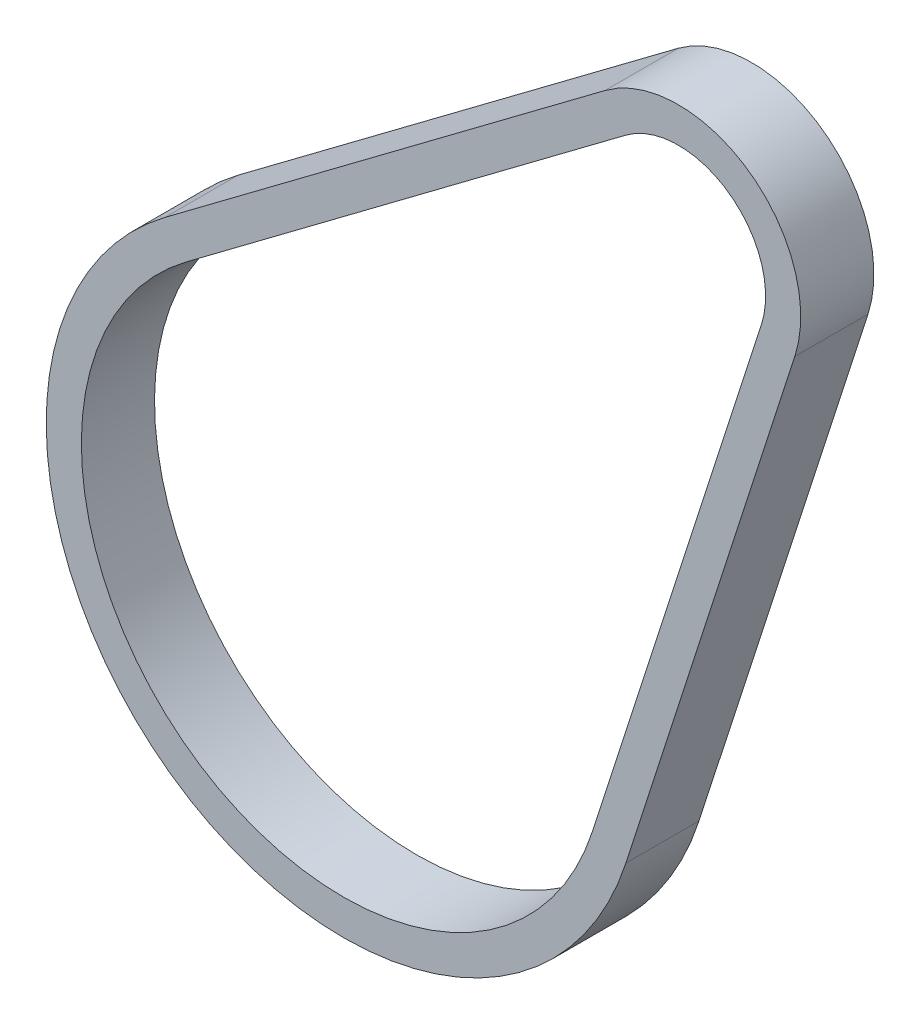
ISO-10303-21;
HEADER;
FILE_DESCRIPTION(('STEP AP214'),'2;1');
FILE_NAME('part.step','',(''),(''),'','','');
FILE_SCHEMA(('AUTOMOTIVE_DESIGN { 1 0 10303 214 1 1 1 1 }'));
ENDSEC;
DATA;
#1=APPLICATION_CONTEXT('core data for automotive mechanical design processes');
#2=APPLICATION_PROTOCOL_DEFINITION('international standard','automotive_design',2000,#1);
#3=PRODUCT_CONTEXT('',#1,'mechanical');
#4=PRODUCT('Part','Part','',(#3));
#5=PRODUCT_RELATED_PRODUCT_CATEGORY('part','',(#4));
#6=PRODUCT_DEFINITION_FORMATION('','',#4);
#7=PRODUCT_DEFINITION_CONTEXT('part definition',#1,'design');
#8=PRODUCT_DEFINITION('design','',#6,#7);
#9=PRODUCT_DEFINITION_SHAPE('','',#8);
#10=(LENGTH_UNIT() NAMED_UNIT(*) SI_UNIT(.MILLI.,.METRE.));
#11=(NAMED_UNIT(*) PLANE_ANGLE_UNIT() SI_UNIT($,.RADIAN.));
#12=(NAMED_UNIT(*) SI_UNIT($,.STERADIAN.) SOLID_ANGLE_UNIT());
#13=UNCERTAINTY_MEASURE_WITH_UNIT(LENGTH_MEASURE(1.E-05),#10,'distance_accuracy_value','');
#14=(GEOMETRIC_REPRESENTATION_CONTEXT(3) GLOBAL_UNCERTAINTY_ASSIGNED_CONTEXT((#13)) GLOBAL_UNIT_ASSIGNED_CONTEXT((#10,
#11,#12)) REPRESENTATION_CONTEXT('',''));
#15=CARTESIAN_POINT('',(0.,0.,0.));
#16=DIRECTION('',(0.,0.,1.));
#17=DIRECTION('',(1.,0.,0.));
#18=AXIS2_PLACEMENT_3D('',#15,#16,#17);
#19=CARTESIAN_POINT('',(22.9066901451778,32.0924847484674,-5.));
#20=DIRECTION('',(0.,0.,1.));
#21=DIRECTION('',(1.,0.,0.));
#22=AXIS2_PLACEMENT_3D('',#19,#20,#21);
#23=CYLINDRICAL_SURFACE('',#22,8.36197243913529);
#24=CARTESIAN_POINT('',(22.9066901451778,32.0924847484674,0.));
#25=DIRECTION('',(0.,0.,-1.));
#26=DIRECTION('',(-1.,0.,0.));
#27=AXIS2_PLACEMENT_3D('',#24,#25,#26);
#28=CIRCLE('',#27,8.36197243913529);
#29=CARTESIAN_POINT('',(30.8640727659891,29.5229235215515,0.));
#30=VERTEX_POINT('',#29);
#31=CARTESIAN_POINT('',(17.8906899962337,38.7829500221722,0.));
#32=VERTEX_POINT('',#31);
#33=EDGE_CURVE('E157',#30,#32,#28,.F.);
#34=ORIENTED_EDGE('',*,*,#33,.F.);
#35=DIRECTION('',(0.,0.,1.));
#36=VECTOR('',#35,1.);
#37=CARTESIAN_POINT('',(30.8640727659891,29.5229235215515,-5.));
#38=LINE('',#37,#36);
#39=CARTESIAN_POINT('',(30.8640727659891,29.5229235215515,-5.));
#40=VERTEX_POINT('',#39);
#41=EDGE_CURVE('E12',#40,#30,#38,.T.);
#42=ORIENTED_EDGE('',*,*,#41,.F.);
#43=CARTESIAN_POINT('',(22.9066901451778,32.0924847484674,-5.));
#44=DIRECTION('',(0.,0.,-1.));
#45=DIRECTION('',(-1.,0.,0.));
#46=AXIS2_PLACEMENT_3D('',#43,#44,#45);
#47=CIRCLE('',#46,8.36197243913529);
#48=CARTESIAN_POINT('',(17.8906899962337,38.7829500221722,-5.));
#49=VERTEX_POINT('',#48);
#50=EDGE_CURVE('E161',#40,#49,#47,.F.);
#51=ORIENTED_EDGE('',*,*,#50,.T.);
#52=DIRECTION('',(0.,0.,1.));
#53=VECTOR('',#52,1.);
#54=CARTESIAN_POINT('',(17.8906899962337,38.7829500221722,-5.));
#55=LINE('',#54,#53);
#56=EDGE_CURVE('E62',#49,#32,#55,.T.);
#57=ORIENTED_EDGE('',*,*,#56,.T.);
#58=EDGE_LOOP('',(#34,#42,#51,#57));
#59=FACE_BOUND('',#58,.T.);
#60=ADVANCED_FACE('F59',(#59),#23,.T.);
#61=CARTESIAN_POINT('',(30.8640727659891,29.5229235215515,-5.));
#62=DIRECTION('',(0.951615504443602,-0.307291281527071,0.));
#63=DIRECTION('',(0.307291281527071,0.951615504443602,0.));
#64=AXIS2_PLACEMENT_3D('',#61,#62,#63);
#65=PLANE('',#64);
#66=DIRECTION('',(0.307291281527071,0.951615504443602,0.));
#67=VECTOR('',#66,1.);
#68=CARTESIAN_POINT('',(30.8640727659891,29.5229235215515,0.));
#69=LINE('',#68,#67);
#70=CARTESIAN_POINT('',(19.3164559799427,-6.23758070872166,0.));
#71=VERTEX_POINT('',#70);
#72=EDGE_CURVE('E165',#71,#30,#69,.T.);
#73=ORIENTED_EDGE('',*,*,#72,.F.);
#74=DIRECTION('',(0.,0.,1.));
#75=VECTOR('',#74,1.);
#76=CARTESIAN_POINT('',(19.3164559799427,-6.23758070872166,-5.));
#77=LINE('',#76,#75);
#78=CARTESIAN_POINT('',(19.3164559799427,-6.23758070872166,-5.));
#79=VERTEX_POINT('',#78);
#80=EDGE_CURVE('E67',#79,#71,#77,.T.);
#81=ORIENTED_EDGE('',*,*,#80,.F.);
#82=DIRECTION('',(0.307291281527071,0.951615504443602,0.));
#83=VECTOR('',#82,1.);
#84=CARTESIAN_POINT('',(30.8640727659891,29.5229235215515,-5.));
#85=LINE('',#84,#83);
#86=EDGE_CURVE('E171',#79,#40,#85,.T.);
#87=ORIENTED_EDGE('',*,*,#86,.T.);
#88=ORIENTED_EDGE('',*,*,#41,.T.);
#89=EDGE_LOOP('',(#73,#81,#87,#88));
#90=FACE_BOUND('',#89,.T.);
#91=ADVANCED_FACE('F197',(#90),#65,.T.);
#92=CARTESIAN_POINT('',(0.,0.,-5.));
#93=DIRECTION('',(0.,0.,1.));
#94=DIRECTION('',(1.,0.,0.));
#95=AXIS2_PLACEMENT_3D('',#92,#93,#94);
#96=CYLINDRICAL_SURFACE('',#95,20.2985931710274);
#97=CARTESIAN_POINT('',(0.,0.,0.));
#98=DIRECTION('',(0.,0.,-1.));
#99=DIRECTION('',(-1.,0.,0.));
#100=AXIS2_PLACEMENT_3D('',#97,#98,#99);
#101=CIRCLE('',#100,20.2985931710274);
#102=CARTESIAN_POINT('',(-12.1762834200109,16.2410285018668,0.));
#103=VERTEX_POINT('',#102);
#104=EDGE_CURVE('E179',#103,#71,#101,.F.);
#105=ORIENTED_EDGE('',*,*,#104,.F.);
#106=DIRECTION('',(0.,0.,1.));
#107=VECTOR('',#106,1.);
#108=CARTESIAN_POINT('',(-12.1762834200109,16.2410285018668,-5.));
#109=LINE('',#108,#107);
#110=CARTESIAN_POINT('',(-12.1762834200109,16.2410285018668,-5.));
#111=VERTEX_POINT('',#110);
#112=EDGE_CURVE('E184',#111,#103,#109,.T.);
#113=ORIENTED_EDGE('',*,*,#112,.F.);
#114=CARTESIAN_POINT('',(0.,0.,-5.));
#115=DIRECTION('',(0.,0.,-1.));
#116=DIRECTION('',(-1.,0.,0.));
#117=AXIS2_PLACEMENT_3D('',#114,#115,#116);
#118=CIRCLE('',#117,20.2985931710274);
#119=EDGE_CURVE('E168',#111,#79,#118,.F.);
#120=ORIENTED_EDGE('',*,*,#119,.T.);
#121=ORIENTED_EDGE('',*,*,#80,.T.);
#122=EDGE_LOOP('',(#105,#113,#120,#121));
#123=FACE_BOUND('',#122,.T.);
#124=ADVANCED_FACE('F201',(#123),#96,.T.);
#125=CARTESIAN_POINT('',(17.8906899962337,38.7829500221722,-5.));
#126=DIRECTION('',(-0.5998584885868,0.800106114006361,0.));
#127=DIRECTION('',(-0.800106114006361,-0.5998584885868,0.));
#128=AXIS2_PLACEMENT_3D('',#125,#126,#127);
#129=PLANE('',#128);
#130=DIRECTION('',(-0.800106114006361,-0.5998584885868,0.));
#131=VECTOR('',#130,1.);
#132=CARTESIAN_POINT('',(17.8906899962337,38.7829500221722,0.));
#133=LINE('',#132,#131);
#134=EDGE_CURVE('E176',#32,#103,#133,.T.);
#135=ORIENTED_EDGE('',*,*,#134,.F.);
#136=ORIENTED_EDGE('',*,*,#56,.F.);
#137=DIRECTION('',(-0.800106114006361,-0.5998584885868,0.));
#138=VECTOR('',#137,1.);
#139=CARTESIAN_POINT('',(17.8906899962337,38.7829500221722,-5.));
#140=LINE('',#139,#138);
#141=EDGE_CURVE('E164',#49,#111,#140,.T.);
#142=ORIENTED_EDGE('',*,*,#141,.T.);
#143=ORIENTED_EDGE('',*,*,#112,.T.);
#144=EDGE_LOOP('',(#135,#136,#142,#143));
#145=FACE_BOUND('',#144,.T.);
#146=ADVANCED_FACE('F192',(#145),#129,.T.);
#147=CARTESIAN_POINT('',(22.9066901451778,32.0924847484674,-5.));
#148=DIRECTION('',(0.,0.,-1.));
#149=DIRECTION('',(-1.,0.,0.));
#150=AXIS2_PLACEMENT_3D('',#147,#148,#149);
#151=PLANE('',#150);
#152=CARTESIAN_POINT('',(22.9066901451778,32.0924847484674,-5.));
#153=DIRECTION('',(0.,0.,-1.));
#154=DIRECTION('',(-1.,0.,0.));
#155=AXIS2_PLACEMENT_3D('',#152,#153,#154);
#156=CIRCLE('',#155,5.96197243913529);
#157=CARTESIAN_POINT('',(28.5801955553244,30.2604225972164,-5.));
#158=VERTEX_POINT('',#157);
#159=CARTESIAN_POINT('',(19.330350368842,36.862695348557,-5.));
#160=VERTEX_POINT('',#159);
#161=EDGE_CURVE('E126',#158,#160,#156,.F.);
#162=ORIENTED_EDGE('',*,*,#161,.T.);
#163=DIRECTION('',(-0.800106114006361,-0.5998584885868,0.));
#164=VECTOR('',#163,1.);
#165=CARTESIAN_POINT('',(19.330350368842,36.862695348557,-5.));
#166=LINE('',#165,#164);
#167=CARTESIAN_POINT('',(-10.7366230474025,14.3207738282516,-5.));
#168=VERTEX_POINT('',#167);
#169=EDGE_CURVE('E135',#160,#168,#166,.T.);
#170=ORIENTED_EDGE('',*,*,#169,.T.);
#171=CARTESIAN_POINT('',(0.,0.,-5.));
#172=DIRECTION('',(0.,0.,-1.));
#173=DIRECTION('',(-1.,0.,0.));
#174=AXIS2_PLACEMENT_3D('',#171,#172,#173);
#175=CIRCLE('',#174,17.8985931710274);
#176=CARTESIAN_POINT('',(17.0325787692781,-5.50008163305669,-5.));
#177=VERTEX_POINT('',#176);
#178=EDGE_CURVE('E75',#168,#177,#175,.F.);
#179=ORIENTED_EDGE('',*,*,#178,.T.);
#180=DIRECTION('',(0.307291281527071,0.951615504443602,0.));
#181=VECTOR('',#180,1.);
#182=CARTESIAN_POINT('',(28.5801955553244,30.2604225972164,-5.));
#183=LINE('',#182,#181);
#184=EDGE_CURVE('E132',#177,#158,#183,.T.);
#185=ORIENTED_EDGE('',*,*,#184,.T.);
#186=EDGE_LOOP('',(#162,#170,#179,#185));
#187=FACE_BOUND('',#186,.T.);
#188=ORIENTED_EDGE('',*,*,#50,.F.);
#189=ORIENTED_EDGE('',*,*,#86,.F.);
#190=ORIENTED_EDGE('',*,*,#119,.F.);
#191=ORIENTED_EDGE('',*,*,#141,.F.);
#192=EDGE_LOOP('',(#188,#189,#190,#191));
#193=FACE_BOUND('',#192,.T.);
#194=ADVANCED_FACE('F139',(#187,#193),#151,.T.);
#195=CARTESIAN_POINT('',(22.9066901451778,32.0924847484674,0.));
#196=DIRECTION('',(0.,0.,-1.));
#197=DIRECTION('',(-1.,0.,0.));
#198=AXIS2_PLACEMENT_3D('',#195,#196,#197);
#199=PLANE('',#198);
#200=DIRECTION('',(-0.800106114006361,-0.5998584885868,0.));
#201=VECTOR('',#200,1.);
#202=CARTESIAN_POINT('',(19.330350368842,36.862695348557,0.));
#203=LINE('',#202,#201);
#204=CARTESIAN_POINT('',(19.330350368842,36.862695348557,0.));
#205=VERTEX_POINT('',#204);
#206=CARTESIAN_POINT('',(-10.7366230474025,14.3207738282516,0.));
#207=VERTEX_POINT('',#206);
#208=EDGE_CURVE('E151',#205,#207,#203,.T.);
#209=ORIENTED_EDGE('',*,*,#208,.F.);
#210=CARTESIAN_POINT('',(22.9066901451778,32.0924847484674,0.));
#211=DIRECTION('',(0.,0.,-1.));
#212=DIRECTION('',(-1.,0.,0.));
#213=AXIS2_PLACEMENT_3D('',#210,#211,#212);
#214=CIRCLE('',#213,5.96197243913529);
#215=CARTESIAN_POINT('',(28.5801955553244,30.2604225972164,0.));
#216=VERTEX_POINT('',#215);
#217=EDGE_CURVE('E83',#216,#205,#214,.F.);
#218=ORIENTED_EDGE('',*,*,#217,.F.);
#219=DIRECTION('',(0.307291281527071,0.951615504443602,0.));
#220=VECTOR('',#219,1.);
#221=CARTESIAN_POINT('',(28.5801955553244,30.2604225972164,0.));
#222=LINE('',#221,#220);
#223=CARTESIAN_POINT('',(17.0325787692781,-5.50008163305669,0.));
#224=VERTEX_POINT('',#223);
#225=EDGE_CURVE('E142',#224,#216,#222,.T.);
#226=ORIENTED_EDGE('',*,*,#225,.F.);
#227=CARTESIAN_POINT('',(0.,0.,0.));
#228=DIRECTION('',(0.,0.,-1.));
#229=DIRECTION('',(-1.,0.,0.));
#230=AXIS2_PLACEMENT_3D('',#227,#228,#229);
#231=CIRCLE('',#230,17.8985931710274);
#232=EDGE_CURVE('E145',#207,#224,#231,.F.);
#233=ORIENTED_EDGE('',*,*,#232,.F.);
#234=EDGE_LOOP('',(#209,#218,#226,#233));
#235=FACE_BOUND('',#234,.T.);
#236=ORIENTED_EDGE('',*,*,#33,.T.);
#237=ORIENTED_EDGE('',*,*,#134,.T.);
#238=ORIENTED_EDGE('',*,*,#104,.T.);
#239=ORIENTED_EDGE('',*,*,#72,.T.);
#240=EDGE_LOOP('',(#236,#237,#238,#239));
#241=FACE_BOUND('',#240,.T.);
#242=ADVANCED_FACE('F194',(#235,#241),#199,.F.);
#243=CARTESIAN_POINT('',(22.9066901451778,32.0924847484674,-5.));
#244=DIRECTION('',(0.,0.,1.));
#245=DIRECTION('',(1.,0.,0.));
#246=AXIS2_PLACEMENT_3D('',#243,#244,#245);
#247=CYLINDRICAL_SURFACE('',#246,5.96197243913529);
#248=ORIENTED_EDGE('',*,*,#217,.T.);
#249=DIRECTION('',(0.,0.,1.));
#250=VECTOR('',#249,1.);
#251=CARTESIAN_POINT('',(19.330350368842,36.862695348557,-5.));
#252=LINE('',#251,#250);
#253=EDGE_CURVE('E122',#160,#205,#252,.T.);
#254=ORIENTED_EDGE('',*,*,#253,.F.);
#255=ORIENTED_EDGE('',*,*,#161,.F.);
#256=DIRECTION('',(0.,0.,1.));
#257=VECTOR('',#256,1.);
#258=CARTESIAN_POINT('',(28.5801955553244,30.2604225972164,-5.));
#259=LINE('',#258,#257);
#260=EDGE_CURVE('E155',#158,#216,#259,.T.);
#261=ORIENTED_EDGE('',*,*,#260,.T.);
#262=EDGE_LOOP('',(#248,#254,#255,#261));
#263=FACE_BOUND('',#262,.T.);
#264=ADVANCED_FACE('F124',(#263),#247,.F.);
#265=CARTESIAN_POINT('',(28.5801955553244,30.2604225972164,-5.));
#266=DIRECTION('',(0.951615504443602,-0.307291281527071,0.));
#267=DIRECTION('',(0.307291281527071,0.951615504443602,0.));
#268=AXIS2_PLACEMENT_3D('',#265,#266,#267);
#269=PLANE('',#268);
#270=ORIENTED_EDGE('',*,*,#225,.T.);
#271=ORIENTED_EDGE('',*,*,#260,.F.);
#272=ORIENTED_EDGE('',*,*,#184,.F.);
#273=DIRECTION('',(0.,0.,1.));
#274=VECTOR('',#273,1.);
#275=CARTESIAN_POINT('',(17.0325787692781,-5.50008163305669,-5.));
#276=LINE('',#275,#274);
#277=EDGE_CURVE('E158',#177,#224,#276,.T.);
#278=ORIENTED_EDGE('',*,*,#277,.T.);
#279=EDGE_LOOP('',(#270,#271,#272,#278));
#280=FACE_BOUND('',#279,.T.);
#281=ADVANCED_FACE('F252',(#280),#269,.F.);
#282=CARTESIAN_POINT('',(0.,0.,-5.));
#283=DIRECTION('',(0.,0.,1.));
#284=DIRECTION('',(1.,0.,0.));
#285=AXIS2_PLACEMENT_3D('',#282,#283,#284);
#286=CYLINDRICAL_SURFACE('',#285,17.8985931710274);
#287=ORIENTED_EDGE('',*,*,#232,.T.);
#288=ORIENTED_EDGE('',*,*,#277,.F.);
#289=ORIENTED_EDGE('',*,*,#178,.F.);
#290=DIRECTION('',(0.,0.,1.));
#291=VECTOR('',#290,1.);
#292=CARTESIAN_POINT('',(-10.7366230474025,14.3207738282516,-5.));
#293=LINE('',#292,#291);
#294=EDGE_CURVE('E131',#168,#207,#293,.T.);
#295=ORIENTED_EDGE('',*,*,#294,.T.);
#296=EDGE_LOOP('',(#287,#288,#289,#295));
#297=FACE_BOUND('',#296,.T.);
#298=ADVANCED_FACE('F261',(#297),#286,.F.);
#299=CARTESIAN_POINT('',(19.330350368842,36.862695348557,-5.));
#300=DIRECTION('',(-0.5998584885868,0.800106114006361,0.));
#301=DIRECTION('',(-0.800106114006361,-0.5998584885868,0.));
#302=AXIS2_PLACEMENT_3D('',#299,#300,#301);
#303=PLANE('',#302);
#304=ORIENTED_EDGE('',*,*,#208,.T.);
#305=ORIENTED_EDGE('',*,*,#294,.F.);
#306=ORIENTED_EDGE('',*,*,#169,.F.);
#307=ORIENTED_EDGE('',*,*,#253,.T.);
#308=EDGE_LOOP('',(#304,#305,#306,#307));
#309=FACE_BOUND('',#308,.T.);
#310=ADVANCED_FACE('F136',(#309),#303,.F.);
#311=CLOSED_SHELL('',(#60,#91,#124,#146,#194,#242,#264,#281,#298,#310));
#312=MANIFOLD_SOLID_BREP('B2',#311);
#313=ADVANCED_BREP_SHAPE_REPRESENTATION('',(#18,#312),#14);
#314=SHAPE_DEFINITION_REPRESENTATION(#9,#313);
ENDSEC;
END-ISO-10303-21;
